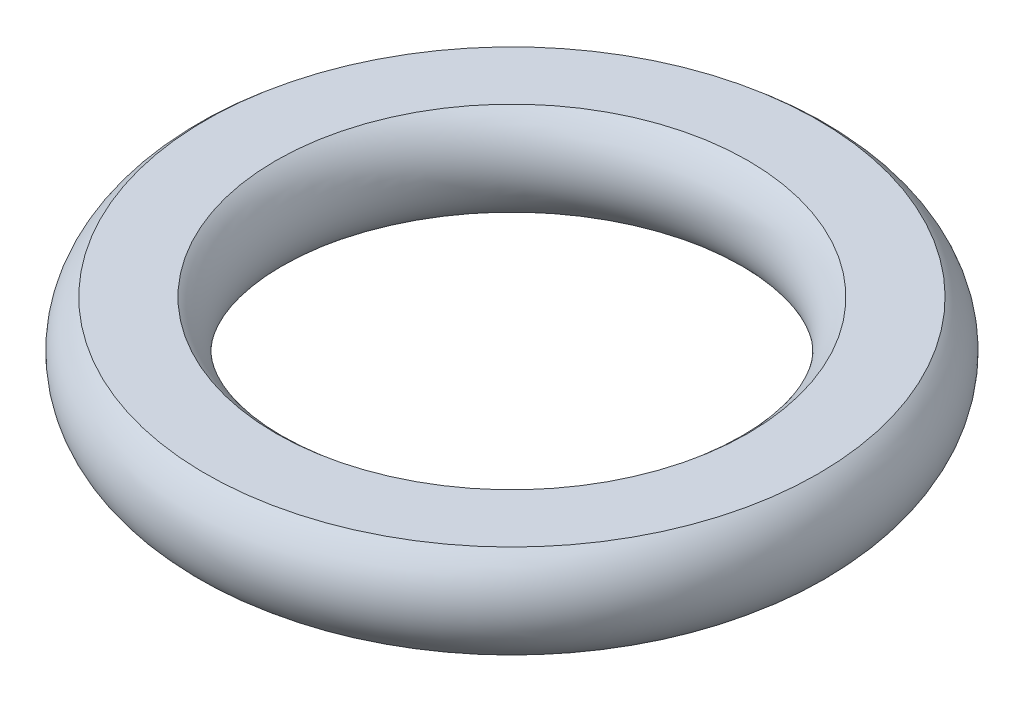
ISO-10303-21;
HEADER;
FILE_DESCRIPTION(('STEP AP214'),'2;1');
FILE_NAME('part.step','',(''),(''),'','','');
FILE_SCHEMA(('AUTOMOTIVE_DESIGN { 1 0 10303 214 1 1 1 1 }'));
ENDSEC;
DATA;
#1=APPLICATION_CONTEXT('core data for automotive mechanical design processes');
#2=APPLICATION_PROTOCOL_DEFINITION('international standard','automotive_design',2000,#1);
#3=PRODUCT_CONTEXT('',#1,'mechanical');
#4=PRODUCT('Part','Part','',(#3));
#5=PRODUCT_RELATED_PRODUCT_CATEGORY('part','',(#4));
#6=PRODUCT_DEFINITION_FORMATION('','',#4);
#7=PRODUCT_DEFINITION_CONTEXT('part definition',#1,'design');
#8=PRODUCT_DEFINITION('design','',#6,#7);
#9=PRODUCT_DEFINITION_SHAPE('','',#8);
#10=(LENGTH_UNIT() NAMED_UNIT(*) SI_UNIT(.MILLI.,.METRE.));
#11=(NAMED_UNIT(*) PLANE_ANGLE_UNIT() SI_UNIT($,.RADIAN.));
#12=(NAMED_UNIT(*) SI_UNIT($,.STERADIAN.) SOLID_ANGLE_UNIT());
#13=UNCERTAINTY_MEASURE_WITH_UNIT(LENGTH_MEASURE(1.E-05),#10,'distance_accuracy_value','');
#14=(GEOMETRIC_REPRESENTATION_CONTEXT(3) GLOBAL_UNCERTAINTY_ASSIGNED_CONTEXT((#13)) GLOBAL_UNIT_ASSIGNED_CONTEXT((#10,
#11,#12)) REPRESENTATION_CONTEXT('',''));
#15=CARTESIAN_POINT('',(0.,0.,0.));
#16=DIRECTION('',(0.,0.,1.));
#17=DIRECTION('',(1.,0.,0.));
#18=AXIS2_PLACEMENT_3D('',#15,#16,#17);
#19=CARTESIAN_POINT('',(11.6,-2.,0.));
#20=DIRECTION('',(0.,-1.,0.));
#21=DIRECTION('',(0.,0.,-1.));
#22=AXIS2_PLACEMENT_3D('',#19,#20,#21);
#23=PLANE('',#22);
#24=CARTESIAN_POINT('',(11.6,-2.,0.));
#25=DIRECTION('',(0.,-1.,0.));
#26=DIRECTION('',(-1.,0.,0.));
#27=AXIS2_PLACEMENT_3D('',#24,#25,#26);
#28=CIRCLE('',#27,10.1);
#29=CARTESIAN_POINT('',(21.7,-2.,0.));
#30=VERTEX_POINT('',#29);
#31=EDGE_CURVE('E11',#30,#30,#28,.T.);
#32=ORIENTED_EDGE('',*,*,#31,.F.);
#33=EDGE_LOOP('',(#32));
#34=FACE_BOUND('',#33,.T.);
#35=CARTESIAN_POINT('',(11.6,-2.,0.));
#36=DIRECTION('',(0.,1.,0.));
#37=DIRECTION('',(-1.,0.,0.));
#38=AXIS2_PLACEMENT_3D('',#35,#36,#37);
#39=CIRCLE('',#38,13.1);
#40=CARTESIAN_POINT('',(24.7,-2.,0.));
#41=VERTEX_POINT('',#40);
#42=EDGE_CURVE('E21',#41,#41,#39,.T.);
#43=ORIENTED_EDGE('',*,*,#42,.F.);
#44=EDGE_LOOP('',(#43));
#45=FACE_BOUND('',#44,.T.);
#46=ADVANCED_FACE('F17',(#34,#45),#23,.T.);
#47=CARTESIAN_POINT('',(11.6,0.,0.));
#48=DIRECTION('',(0.,-1.,0.));
#49=DIRECTION('',(-1.,0.,0.));
#50=AXIS2_PLACEMENT_3D('',#47,#48,#49);
#51=TOROIDAL_SURFACE('',#50,11.6,2.5);
#52=CARTESIAN_POINT('',(11.6,2.,0.));
#53=DIRECTION('',(0.,-1.,0.));
#54=DIRECTION('',(-1.,0.,0.));
#55=AXIS2_PLACEMENT_3D('',#52,#53,#54);
#56=CIRCLE('',#55,10.1);
#57=CARTESIAN_POINT('',(21.7,2.,0.));
#58=VERTEX_POINT('',#57);
#59=EDGE_CURVE('E65',#58,#58,#56,.T.);
#60=ORIENTED_EDGE('',*,*,#59,.F.);
#61=CARTESIAN_POINT('',(23.2,0.,0.));
#62=DIRECTION('',(0.,0.,1.));
#63=DIRECTION('',(1.,0.,0.));
#64=AXIS2_PLACEMENT_3D('',#61,#62,#63);
#65=CIRCLE('',#64,2.5);
#66=EDGE_CURVE('E27',#58,#30,#65,.T.);
#67=ORIENTED_EDGE('',*,*,#66,.T.);
#68=ORIENTED_EDGE('',*,*,#31,.T.);
#69=ORIENTED_EDGE('',*,*,#66,.F.);
#70=EDGE_LOOP('',(#60,#67,#68,#69));
#71=FACE_BOUND('',#70,.T.);
#72=ADVANCED_FACE('F19',(#71),#51,.T.);
#73=CARTESIAN_POINT('',(11.6,2.,0.));
#74=DIRECTION('',(0.,-1.,0.));
#75=DIRECTION('',(0.,0.,-1.));
#76=AXIS2_PLACEMENT_3D('',#73,#74,#75);
#77=PLANE('',#76);
#78=ORIENTED_EDGE('',*,*,#59,.T.);
#79=EDGE_LOOP('',(#78));
#80=FACE_BOUND('',#79,.T.);
#81=CARTESIAN_POINT('',(11.6,2.,0.));
#82=DIRECTION('',(0.,-1.,0.));
#83=DIRECTION('',(-1.,0.,0.));
#84=AXIS2_PLACEMENT_3D('',#81,#82,#83);
#85=CIRCLE('',#84,13.1);
#86=CARTESIAN_POINT('',(24.7,2.,0.));
#87=VERTEX_POINT('',#86);
#88=EDGE_CURVE('E57',#87,#87,#85,.T.);
#89=ORIENTED_EDGE('',*,*,#88,.F.);
#90=EDGE_LOOP('',(#89));
#91=FACE_BOUND('',#90,.T.);
#92=ADVANCED_FACE('F74',(#80,#91),#77,.F.);
#93=CARTESIAN_POINT('',(11.6,0.,0.));
#94=DIRECTION('',(0.,-1.,0.));
#95=DIRECTION('',(-1.,0.,0.));
#96=AXIS2_PLACEMENT_3D('',#93,#94,#95);
#97=TOROIDAL_SURFACE('',#96,11.6,2.5);
#98=ORIENTED_EDGE('',*,*,#42,.T.);
#99=CARTESIAN_POINT('',(23.2,0.,0.));
#100=DIRECTION('',(0.,0.,1.));
#101=DIRECTION('',(1.,0.,0.));
#102=AXIS2_PLACEMENT_3D('',#99,#100,#101);
#103=CIRCLE('',#102,2.5);
#104=EDGE_CURVE('E53',#41,#87,#103,.T.);
#105=ORIENTED_EDGE('',*,*,#104,.T.);
#106=ORIENTED_EDGE('',*,*,#88,.T.);
#107=ORIENTED_EDGE('',*,*,#104,.F.);
#108=EDGE_LOOP('',(#98,#105,#106,#107));
#109=FACE_BOUND('',#108,.T.);
#110=ADVANCED_FACE('F54',(#109),#97,.T.);
#111=CLOSED_SHELL('',(#46,#72,#92,#110));
#112=MANIFOLD_SOLID_BREP('B1',#111);
#113=ADVANCED_BREP_SHAPE_REPRESENTATION('',(#18,#112),#14);
#114=SHAPE_DEFINITION_REPRESENTATION(#9,#113);
ENDSEC;
END-ISO-10303-21;
